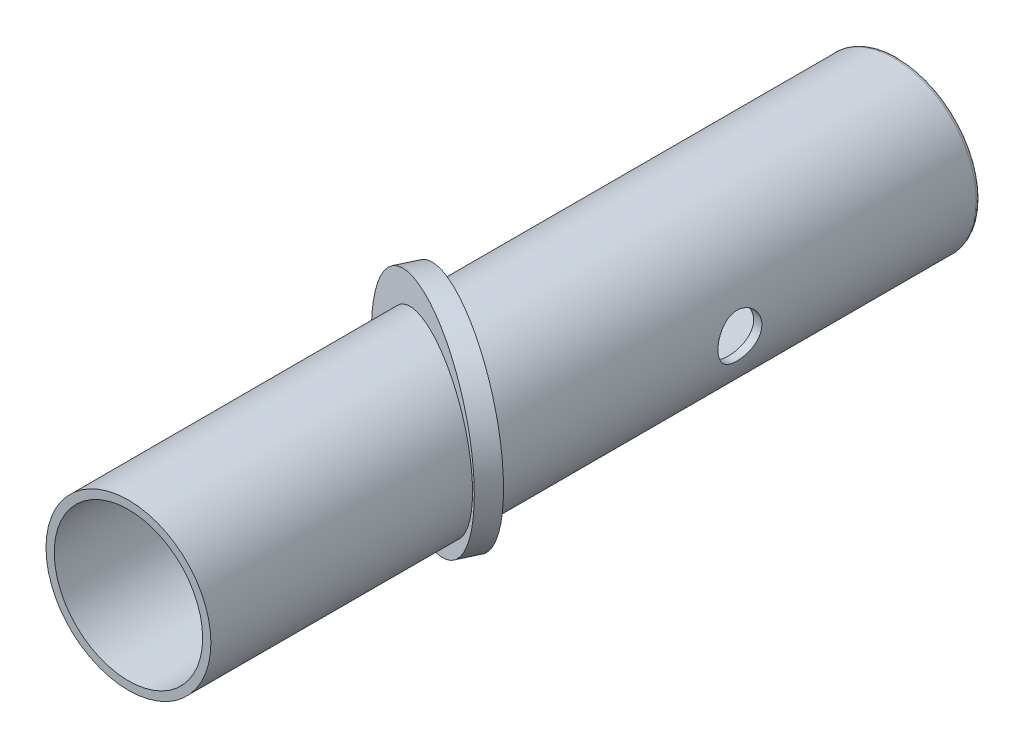
ISO-10303-21;
HEADER;
FILE_DESCRIPTION(('STEP AP214'),'2;1');
FILE_NAME('part.step','',(''),(''),'','','');
FILE_SCHEMA(('AUTOMOTIVE_DESIGN { 1 0 10303 214 1 1 1 1 }'));
ENDSEC;
DATA;
#1=APPLICATION_CONTEXT('core data for automotive mechanical design processes');
#2=APPLICATION_PROTOCOL_DEFINITION('international standard','automotive_design',2000,#1);
#3=PRODUCT_CONTEXT('',#1,'mechanical');
#4=PRODUCT('Part','Part','',(#3));
#5=PRODUCT_RELATED_PRODUCT_CATEGORY('part','',(#4));
#6=PRODUCT_DEFINITION_FORMATION('','',#4);
#7=PRODUCT_DEFINITION_CONTEXT('part definition',#1,'design');
#8=PRODUCT_DEFINITION('design','',#6,#7);
#9=PRODUCT_DEFINITION_SHAPE('','',#8);
#10=(LENGTH_UNIT() NAMED_UNIT(*) SI_UNIT(.MILLI.,.METRE.));
#11=(NAMED_UNIT(*) PLANE_ANGLE_UNIT() SI_UNIT($,.RADIAN.));
#12=(NAMED_UNIT(*) SI_UNIT($,.STERADIAN.) SOLID_ANGLE_UNIT());
#13=UNCERTAINTY_MEASURE_WITH_UNIT(LENGTH_MEASURE(1.E-05),#10,'distance_accuracy_value','');
#14=(GEOMETRIC_REPRESENTATION_CONTEXT(3) GLOBAL_UNCERTAINTY_ASSIGNED_CONTEXT((#13)) GLOBAL_UNIT_ASSIGNED_CONTEXT((#10,
#11,#12)) REPRESENTATION_CONTEXT('',''));
#15=CARTESIAN_POINT('',(0.,0.,0.));
#16=DIRECTION('',(0.,0.,1.));
#17=DIRECTION('',(1.,0.,0.));
#18=AXIS2_PLACEMENT_3D('',#15,#16,#17);
#19=CARTESIAN_POINT('',(0.,0.,70.));
#20=DIRECTION('',(0.,0.,-1.));
#21=DIRECTION('',(-1.,0.,0.));
#22=AXIS2_PLACEMENT_3D('',#19,#20,#21);
#23=CYLINDRICAL_SURFACE('',#22,7.5);
#24=CARTESIAN_POINT('',(0.,0.,0.369999999999995));
#25=DIRECTION('',(0.,0.,1.));
#26=DIRECTION('',(1.,0.,0.));
#27=AXIS2_PLACEMENT_3D('',#24,#25,#26);
#28=CIRCLE('',#27,7.5);
#29=CARTESIAN_POINT('',(7.5,0.,0.369999999999995));
#30=VERTEX_POINT('',#29);
#31=EDGE_CURVE('E50',#30,#30,#28,.T.);
#32=ORIENTED_EDGE('',*,*,#31,.T.);
#33=EDGE_LOOP('',(#32));
#34=FACE_BOUND('',#33,.T.);
#35=CARTESIAN_POINT('',(0.,0.,40.4973074361625));
#36=DIRECTION('',(-0.4226182617407,0.,0.90630778703665));
#37=DIRECTION('',(-0.90630778703665,0.,-0.4226182617407));
#38=AXIS2_PLACEMENT_3D('',#35,#36,#37);
#39=ELLIPSE('',#38,8.27533439221869,7.5);
#40=CARTESIAN_POINT('',(-7.5,0.,37.));
#41=VERTEX_POINT('',#40);
#42=EDGE_CURVE('E10',#41,#41,#39,.T.);
#43=ORIENTED_EDGE('',*,*,#42,.F.);
#44=EDGE_LOOP('',(#43));
#45=FACE_BOUND('',#44,.T.);
#46=CARTESIAN_POINT('',(7.5,0.,23.8752094524381));
#47=CARTESIAN_POINT('',(7.49999833810161,-0.110254555832854,23.8752068355033));
#48=CARTESIAN_POINT('',(7.49754486162151,-0.220537160221841,23.8660618382485));
#49=CARTESIAN_POINT('',(7.48799573621659,-0.437925451354464,23.8297882216995));
#50=CARTESIAN_POINT('',(7.48089785332586,-0.545029583319087,23.802650948012));
#51=CARTESIAN_POINT('',(7.4628433325279,-0.752891589045313,23.7313377855741));
#52=CARTESIAN_POINT('',(7.45189167130375,-0.853657451015286,23.6871838647721));
#53=CARTESIAN_POINT('',(7.42728699151678,-1.04635368639266,23.5831722097715));
#54=CARTESIAN_POINT('',(7.4136337929518,-1.13828347044963,23.5233134290789));
#55=CARTESIAN_POINT('',(7.38474614901995,-1.31282950374002,23.3881259360248));
#56=CARTESIAN_POINT('',(7.36948467678681,-1.39521168986279,23.3125007844299));
#57=CARTESIAN_POINT('',(7.33927409679591,-1.54628713660638,23.1485609693748));
#58=CARTESIAN_POINT('',(7.32432502947243,-1.61497863495665,23.0602446748206));
#59=CARTESIAN_POINT('',(7.29615537464372,-1.73786409243415,22.8715612176127));
#60=CARTESIAN_POINT('',(7.28296888563238,-1.79178877736488,22.7710131241764));
#61=CARTESIAN_POINT('',(7.26021477318187,-1.88187548076994,22.5618693413457));
#62=CARTESIAN_POINT('',(7.25064648253265,-1.91804077451369,22.4532751401067));
#63=CARTESIAN_POINT('',(7.23649115802399,-1.97076920226504,22.2337139146131));
#64=CARTESIAN_POINT('',(7.2317964781149,-1.98775670244692,22.1228559125074));
#65=CARTESIAN_POINT('',(7.2275983091637,-2.0029703470582,21.8997717691316));
#66=CARTESIAN_POINT('',(7.22809385014446,-2.00119999705754,21.7875458874141));
#67=CARTESIAN_POINT('',(7.2341237880203,-1.97928510002699,21.5682240370641));
#68=CARTESIAN_POINT('',(7.23951735511531,-1.95965406064765,21.4610722703997));
#69=CARTESIAN_POINT('',(7.25451013080688,-1.90339748722183,21.2516411179819));
#70=CARTESIAN_POINT('',(7.26410967552612,-1.86677059492995,21.1493621223628));
#71=CARTESIAN_POINT('',(7.28655661748386,-1.77714356965256,20.9512413086296));
#72=CARTESIAN_POINT('',(7.29943942818703,-1.72396341137785,20.8554851131519));
#73=CARTESIAN_POINT('',(7.32698229642445,-1.60286503823778,20.6740752935866));
#74=CARTESIAN_POINT('',(7.34164270355186,-1.53494392224252,20.5884236632817));
#75=CARTESIAN_POINT('',(7.37167510629864,-1.38366607263419,20.4267204549834));
#76=CARTESIAN_POINT('',(7.38705471488831,-1.29987812728299,20.3510731341232));
#77=CARTESIAN_POINT('',(7.41636381276316,-1.12061766820637,20.2148206720879));
#78=CARTESIAN_POINT('',(7.43029324488555,-1.02514469420509,20.1542161237357));
#79=CARTESIAN_POINT('',(7.45521820398293,-0.824598255497453,20.0495915496135));
#80=CARTESIAN_POINT('',(7.4662007283356,-0.719484902551791,20.0056446819896));
#81=CARTESIAN_POINT('',(7.48390044400999,-0.503002294390397,19.9361622636248));
#82=CARTESIAN_POINT('',(7.49061856733749,-0.391634411928325,19.9106226897142));
#83=CARTESIAN_POINT('',(7.49889158558384,-0.169254083145517,19.8793145755203));
#84=CARTESIAN_POINT('',(7.50058997470959,-0.0583242376413814,19.8729964125873));
#85=CARTESIAN_POINT('',(7.49904471691695,0.163010045901198,19.8787926166851));
#86=CARTESIAN_POINT('',(7.49580158080353,0.273414537062114,19.8909050785439));
#87=CARTESIAN_POINT('',(7.48483035496021,0.488602449901781,19.9327678998981));
#88=CARTESIAN_POINT('',(7.47718026546329,0.593449852027783,19.9622116986359));
#89=CARTESIAN_POINT('',(7.45826294894139,0.796706971176066,20.0375453969461));
#90=CARTESIAN_POINT('',(7.44699532996161,0.895115989216028,20.0834370786887));
#91=CARTESIAN_POINT('',(7.42175660559528,1.08483847466795,20.1913833396187));
#92=CARTESIAN_POINT('',(7.40773686604957,1.17597518846119,20.2537369192359));
#93=CARTESIAN_POINT('',(7.37861452365563,1.34668463539715,20.3924610825961));
#94=CARTESIAN_POINT('',(7.3635117072752,1.42625507879918,20.4688344350392));
#95=CARTESIAN_POINT('',(7.33339745866704,1.57388924478774,20.6359950299327));
#96=CARTESIAN_POINT('',(7.31840061429312,1.64156519249816,20.7271280138333));
#97=CARTESIAN_POINT('',(7.29066447182727,1.76067191185119,20.9197741485378));
#98=CARTESIAN_POINT('',(7.27792507956316,1.81210336122161,21.0212868660605));
#99=CARTESIAN_POINT('',(7.2562926837321,1.89687411586113,21.2313047595143));
#100=CARTESIAN_POINT('',(7.24737748318009,1.93031812253958,21.3397652642557));
#101=CARTESIAN_POINT('',(7.234398251268,1.97841205118791,21.5610487721129));
#102=CARTESIAN_POINT('',(7.23033298020014,1.99306677602478,21.6738706527861));
#103=CARTESIAN_POINT('',(7.22761744573588,2.00288989653714,21.8967042403219));
#104=CARTESIAN_POINT('',(7.22879397743239,1.99868155618109,22.0066867726964));
#105=CARTESIAN_POINT('',(7.23602396081087,1.97234376000439,22.2243129664482));
#106=CARTESIAN_POINT('',(7.24207728699439,1.95021476535026,22.3319566879387));
#107=CARTESIAN_POINT('',(7.25827571073158,1.88902515699699,22.541065204568));
#108=CARTESIAN_POINT('',(7.26838885019644,1.8500966107558,22.6425712951703));
#109=CARTESIAN_POINT('',(7.29156818136177,1.75651554562386,22.8376882829723));
#110=CARTESIAN_POINT('',(7.30463483621364,1.70186056024617,22.9312979387386));
#111=CARTESIAN_POINT('',(7.3327292144046,1.57648909268817,23.1109398119348));
#112=CARTESIAN_POINT('',(7.3478033310169,1.5053472976791,23.1966679874144));
#113=CARTESIAN_POINT('',(7.37795503783007,1.349830535111,23.3551719041055));
#114=CARTESIAN_POINT('',(7.39303262798441,1.26545235435875,23.427944491107));
#115=CARTESIAN_POINT('',(7.42187812403968,1.08367998108869,23.560001690085));
#116=CARTESIAN_POINT('',(7.43561111314551,0.986045961751781,23.6189644630875));
#117=CARTESIAN_POINT('',(7.45983810102897,0.78188864041689,23.7195468683675));
#118=CARTESIAN_POINT('',(7.47033417683594,0.675371094696297,23.7611776281018));
#119=CARTESIAN_POINT('',(7.48554752513468,0.474374704880991,23.8204847378537));
#120=CARTESIAN_POINT('',(7.49092770592602,0.380762016565036,23.8409588360307));
#121=CARTESIAN_POINT('',(7.49815449036456,0.191439795317076,23.8683216586052));
#122=CARTESIAN_POINT('',(7.5000014429727,0.0957304704048601,23.8752117246382));
#123=CARTESIAN_POINT('',(7.5,0.,23.8752094524381));
#124=B_SPLINE_CURVE_WITH_KNOTS('',3,(#46,#47,#48,#49,#50,#51,#52,#53,#54,#55,#56,#57,#58,#59,
#60,#61,#62,#63,#64,#65,#66,#67,#68,#69,#70,#71,#72,#73,#74,#75,#76,#77,#78,#79,#80,#81,#82,#83,
#84,#85,#86,#87,#88,#89,#90,#91,#92,#93,#94,#95,#96,#97,#98,#99,#100,#101,#102,#103,#104,#105,
#106,#107,#108,#109,#110,#111,#112,#113,#114,#115,#116,#117,#118,#119,#120,#121,#122,#123),
.UNSPECIFIED.,.T.,.F.,(4,2,2,2,2,2,2,2,2,2,2,2,2,2,2,2,2,2,2,2,2,2,2,2,2,2,2,2,2,2,2,2,2,2,2,2,
2,2,4),(0.,0.330412598949569,0.66098424376145,0.991130552971933,1.32129886708675,
1.65834897954967,1.99544244925149,2.33832582523229,2.681145941297,3.01622158250468,
3.3512346040432,3.67691002045997,4.0026114681294,4.33198673346499,4.6614268811763,
5.00161259812323,5.34181171937598,5.68348809603042,6.02508977190139,6.35682717524548,
6.68853028925352,7.01453535642117,7.34057575775616,7.67300286004551,8.00549568258888,
8.34736496382789,8.68921998024109,9.02906297699388,9.36881908663984,9.69743342403613,
10.026039305206,10.352107654483,10.67822717123,11.0139433957139,11.3497412433245,
11.692722522809,12.0354832614518,12.3223981899334,12.6092847796638),.UNSPECIFIED.);
#125=CARTESIAN_POINT('',(7.5,0.,23.8752094524381));
#126=VERTEX_POINT('',#125);
#127=EDGE_CURVE('E105',#126,#126,#124,.T.);
#128=ORIENTED_EDGE('',*,*,#127,.F.);
#129=EDGE_LOOP('',(#128));
#130=FACE_BOUND('',#129,.T.);
#131=ADVANCED_FACE('F37',(#34,#45,#130),#23,.T.);
#132=CARTESIAN_POINT('',(0.,0.,70.));
#133=DIRECTION('',(0.,0.,-1.));
#134=DIRECTION('',(-1.,0.,0.));
#135=AXIS2_PLACEMENT_3D('',#132,#133,#134);
#136=CYLINDRICAL_SURFACE('',#135,6.75);
#137=CARTESIAN_POINT('',(0.,0.,0.369999999999995));
#138=DIRECTION('',(0.,0.,1.));
#139=DIRECTION('',(1.,0.,0.));
#140=AXIS2_PLACEMENT_3D('',#137,#138,#139);
#141=CIRCLE('',#140,6.75);
#142=CARTESIAN_POINT('',(6.75,0.,0.369999999999995));
#143=VERTEX_POINT('',#142);
#144=EDGE_CURVE('E55',#143,#143,#141,.F.);
#145=ORIENTED_EDGE('',*,*,#144,.T.);
#146=EDGE_LOOP('',(#145));
#147=FACE_BOUND('',#146,.T.);
#148=CARTESIAN_POINT('',(0.,0.,70.));
#149=DIRECTION('',(0.,0.,1.));
#150=DIRECTION('',(1.,0.,0.));
#151=AXIS2_PLACEMENT_3D('',#148,#149,#150);
#152=CIRCLE('',#151,6.75);
#153=CARTESIAN_POINT('',(6.75,0.,70.));
#154=VERTEX_POINT('',#153);
#155=EDGE_CURVE('E63',#154,#154,#152,.T.);
#156=ORIENTED_EDGE('',*,*,#155,.T.);
#157=EDGE_LOOP('',(#156));
#158=FACE_BOUND('',#157,.T.);
#159=CARTESIAN_POINT('',(6.75,0.,23.8752094524381));
#160=CARTESIAN_POINT('',(6.74999895357174,-0.109780507827997,23.8752079552797));
#161=CARTESIAN_POINT('',(6.74729613961413,-0.219576188157136,23.8661406206399));
#162=CARTESIAN_POINT('',(6.7367779386325,-0.435974163095877,23.8301943682222));
#163=CARTESIAN_POINT('',(6.72896091933207,-0.542575426794903,23.803309763756));
#164=CARTESIAN_POINT('',(6.70907157188689,-0.749431834060115,23.7327025235036));
#165=CARTESIAN_POINT('',(6.69700543365303,-0.849695959996787,23.6890043723485));
#166=CARTESIAN_POINT('',(6.66987440163433,-1.04147390890969,23.5861097716068));
#167=CARTESIAN_POINT('',(6.65480913098969,-1.13298663007551,23.5269113740218));
#168=CARTESIAN_POINT('',(6.62281609852056,-1.30723335618362,23.3929450091111));
#169=CARTESIAN_POINT('',(6.60585087876647,-1.38968692651201,23.3178212521535));
#170=CARTESIAN_POINT('',(6.57219540945145,-1.54102903218837,23.1548952063222));
#171=CARTESIAN_POINT('',(6.55550520520277,-1.60991535224076,23.067090850978));
#172=CARTESIAN_POINT('',(6.52389477512094,-1.73363046162768,22.8789389284841));
#173=CARTESIAN_POINT('',(6.50902118305508,-1.78811926435753,22.7783592416816));
#174=CARTESIAN_POINT('',(6.48328681863478,-1.8792957384254,22.5689526467707));
#175=CARTESIAN_POINT('',(6.47242510947398,-1.91598756612525,22.4601276711642));
#176=CARTESIAN_POINT('',(6.45633424438028,-1.969521633465,22.2404639335786));
#177=CARTESIAN_POINT('',(6.45095899226571,-1.98687991736363,22.1297619221615));
#178=CARTESIAN_POINT('',(6.44601480296172,-2.00286530285513,21.9068965338744));
#179=CARTESIAN_POINT('',(6.4464444977017,-2.00149681784523,21.7947335075514));
#180=CARTESIAN_POINT('',(6.45293201970745,-1.9804733446018,21.5763062217923));
#181=CARTESIAN_POINT('',(6.45879167330767,-1.96146221318409,21.4699731354392));
#182=CARTESIAN_POINT('',(6.47515865740568,-1.90673230983323,21.2620788744826));
#183=CARTESIAN_POINT('',(6.48566643641889,-1.87101192554119,21.1605181614302));
#184=CARTESIAN_POINT('',(6.51030570383787,-1.78339749199777,20.9634647774697));
#185=CARTESIAN_POINT('',(6.52448396112885,-1.73129268359001,20.8680719123078));
#186=CARTESIAN_POINT('',(6.55484386592104,-1.61253500191673,20.6871667238014));
#187=CARTESIAN_POINT('',(6.57102598825196,-1.54587867770291,20.6016567515928));
#188=CARTESIAN_POINT('',(6.60437650489371,-1.39670138313682,20.4392895715196));
#189=CARTESIAN_POINT('',(6.62155824094315,-1.31364532643575,20.3629258946316));
#190=CARTESIAN_POINT('',(6.65438787229502,-1.1356922979027,20.225097525485));
#191=CARTESIAN_POINT('',(6.67003567568601,-1.04079461730789,20.1636337256849));
#192=CARTESIAN_POINT('',(6.69817136452503,-0.840970715212555,20.0570600205953));
#193=CARTESIAN_POINT('',(6.71063839704817,-0.735984228183308,20.0120572392073));
#194=CARTESIAN_POINT('',(6.73085759101367,-0.519478083537604,19.9404919485223));
#195=CARTESIAN_POINT('',(6.73861103395821,-0.407960210682308,19.9139244268805));
#196=CARTESIAN_POINT('',(6.74832777999005,-0.185754367320838,19.8807999840593));
#197=CARTESIAN_POINT('',(6.75048461171956,-0.0751744544281668,19.8735739513063));
#198=CARTESIAN_POINT('',(6.74933156704897,0.145624015554762,19.8774653941636));
#199=CARTESIAN_POINT('',(6.74602240079799,0.25584261772287,19.8885804868724));
#200=CARTESIAN_POINT('',(6.7344357004489,0.470280296286971,19.9282966132336));
#201=CARTESIAN_POINT('',(6.7262687424719,0.574577941871163,19.9565087350157));
#202=CARTESIAN_POINT('',(6.70590917298922,0.776938410671506,20.0291520700894));
#203=CARTESIAN_POINT('',(6.69371608204546,0.875000489687504,20.0735852150718));
#204=CARTESIAN_POINT('',(6.66622462760101,1.06458432647057,20.1785460025249));
#205=CARTESIAN_POINT('',(6.65086191667895,1.15590648191309,20.2394168704825));
#206=CARTESIAN_POINT('',(6.61879673108033,1.32726877958423,20.3751065285707));
#207=CARTESIAN_POINT('',(6.60209392925366,1.40730615368216,20.4499287305139));
#208=CARTESIAN_POINT('',(6.56849170341841,1.55675893312647,20.6145391598418));
#209=CARTESIAN_POINT('',(6.55160621339354,1.62569863061477,20.7047630583946));
#210=CARTESIAN_POINT('',(6.52018017865221,1.74748984960258,20.8958652806182));
#211=CARTESIAN_POINT('',(6.50563956650847,1.80034183374538,20.9967432977902));
#212=CARTESIAN_POINT('',(6.48071797240951,1.88808842707279,21.2059409511222));
#213=CARTESIAN_POINT('',(6.47031687516707,1.92307011535889,21.3142215286699));
#214=CARTESIAN_POINT('',(6.45490091242077,1.97420394917347,21.5355004948714));
#215=CARTESIAN_POINT('',(6.44988425845241,1.99036234708587,21.6484973040462));
#216=CARTESIAN_POINT('',(6.44597836214003,2.0029730578667,21.87106801564));
#217=CARTESIAN_POINT('',(6.44684840439166,2.00019948383777,21.9805944155486));
#218=CARTESIAN_POINT('',(6.45404087889643,1.97686673394052,22.1975443736782));
#219=CARTESIAN_POINT('',(6.46036310271065,1.95630823799625,22.3049680121279));
#220=CARTESIAN_POINT('',(6.47758812520025,1.89848338352936,22.5134317358436));
#221=CARTESIAN_POINT('',(6.48843594234712,1.8614172236977,22.6145322303961));
#222=CARTESIAN_POINT('',(6.51348097902859,1.77178472154567,22.8091600015472));
#223=CARTESIAN_POINT('',(6.52767882723387,1.71921546943394,22.902685852249));
#224=CARTESIAN_POINT('',(6.55845570703591,1.59787466680533,23.0831138913838));
#225=CARTESIAN_POINT('',(6.5751015613966,1.52859251647181,23.1696612962883));
#226=CARTESIAN_POINT('',(6.60856912953431,1.37671764046891,23.330152613648));
#227=CARTESIAN_POINT('',(6.6253908875096,1.29412149047669,23.4040932735898));
#228=CARTESIAN_POINT('',(6.65788498158106,1.11514975355066,23.5393526719684));
#229=CARTESIAN_POINT('',(6.67351137161211,1.01845059715654,23.6002554312085));
#230=CARTESIAN_POINT('',(6.70130862680841,0.815722252703583,23.7048519226204));
#231=CARTESIAN_POINT('',(6.71348118010808,0.709697655959116,23.7485540660082));
#232=CARTESIAN_POINT('',(6.73187584792081,0.503779578000332,23.8133790632891));
#233=CARTESIAN_POINT('',(6.73861704128744,0.404558947214438,23.8365037258882));
#234=CARTESIAN_POINT('',(6.74767925362443,0.203562954982656,23.8674184043831));
#235=CARTESIAN_POINT('',(6.75000097024364,0.101787999327255,23.8752108405968));
#236=CARTESIAN_POINT('',(6.75,0.,23.8752094524381));
#237=B_SPLINE_CURVE_WITH_KNOTS('',3,(#159,#160,#161,#162,#163,#164,#165,#166,#167,#168,#169,
#170,#171,#172,#173,#174,#175,#176,#177,#178,#179,#180,#181,#182,#183,#184,#185,#186,#187,#188,
#189,#190,#191,#192,#193,#194,#195,#196,#197,#198,#199,#200,#201,#202,#203,#204,#205,#206,#207,
#208,#209,#210,#211,#212,#213,#214,#215,#216,#217,#218,#219,#220,#221,#222,#223,#224,#225,#226,
#227,#228,#229,#230,#231,#232,#233,#234,#235,#236),.UNSPECIFIED.,.T.,.F.,(4,2,2,2,2,2,2,2,2,2,2,
2,2,2,2,2,2,2,2,2,2,2,2,2,2,2,2,2,2,2,2,2,2,2,2,2,2,2,4),(0.,0.328967704896551,0.65804045609361,
0.986635799666843,1.31527245939874,1.65221766342732,1.98921783920761,2.33358031728811,
2.67786233309664,3.01271657391682,3.34749189993189,3.67051088328316,3.99356104277411,
4.320949543795,4.64841577077394,4.98920393821033,5.33001251280931,5.6730010975093,
6.01589639080056,6.34676605629498,6.67759273818107,7.00116255654673,7.32477092000541,
7.6557430431897,7.98679621234535,8.32955627438707,8.67230647855638,9.0133701910724,
9.35432058281285,9.68141576699805,10.0084984467677,10.3317180629328,10.6549983831726,
10.9897984380869,11.324684740422,11.6690395665297,12.0132257909865,12.3182913470032,
12.6233087420508),.UNSPECIFIED.);
#238=CARTESIAN_POINT('',(6.75,0.,23.8752094524381));
#239=VERTEX_POINT('',#238);
#240=EDGE_CURVE('E41',#239,#239,#237,.T.);
#241=ORIENTED_EDGE('',*,*,#240,.T.);
#242=EDGE_LOOP('',(#241));
#243=FACE_BOUND('',#242,.T.);
#244=ADVANCED_FACE('F79',(#147,#158,#243),#136,.F.);
#245=CARTESIAN_POINT('',(0.,0.,0.));
#246=DIRECTION('',(0.,0.,1.));
#247=DIRECTION('',(1.,0.,0.));
#248=AXIS2_PLACEMENT_3D('',#245,#246,#247);
#249=PLANE('',#248);
#250=CARTESIAN_POINT('',(0.,0.,0.));
#251=DIRECTION('',(0.,0.,1.));
#252=DIRECTION('',(1.,0.,0.));
#253=AXIS2_PLACEMENT_3D('',#250,#251,#252);
#254=CIRCLE('',#253,7.12);
#255=CARTESIAN_POINT('',(7.12,0.,0.));
#256=VERTEX_POINT('',#255);
#257=EDGE_CURVE('E73',#256,#256,#254,.T.);
#258=ORIENTED_EDGE('',*,*,#257,.T.);
#259=EDGE_LOOP('',(#258));
#260=FACE_BOUND('',#259,.T.);
#261=CARTESIAN_POINT('',(0.,0.,0.));
#262=DIRECTION('',(0.,0.,1.));
#263=DIRECTION('',(1.,0.,0.));
#264=AXIS2_PLACEMENT_3D('',#261,#262,#263);
#265=CIRCLE('',#264,7.13);
#266=CARTESIAN_POINT('',(7.13,0.,0.));
#267=VERTEX_POINT('',#266);
#268=EDGE_CURVE('E70',#267,#267,#265,.F.);
#269=ORIENTED_EDGE('',*,*,#268,.T.);
#270=EDGE_LOOP('',(#269));
#271=FACE_BOUND('',#270,.T.);
#272=ADVANCED_FACE('F85',(#260,#271),#249,.F.);
#273=CARTESIAN_POINT('',(0.,0.,0.369999999999995));
#274=DIRECTION('',(0.,0.,1.));
#275=DIRECTION('',(1.,0.,0.));
#276=AXIS2_PLACEMENT_3D('',#273,#274,#275);
#277=TOROIDAL_SURFACE('',#276,7.12,0.37);
#278=ORIENTED_EDGE('',*,*,#144,.F.);
#279=EDGE_LOOP('',(#278));
#280=FACE_BOUND('',#279,.T.);
#281=ORIENTED_EDGE('',*,*,#257,.F.);
#282=EDGE_LOOP('',(#281));
#283=FACE_BOUND('',#282,.T.);
#284=ADVANCED_FACE('F82',(#280,#283),#277,.T.);
#285=CARTESIAN_POINT('',(0.,0.,0.369999999999995));
#286=DIRECTION('',(0.,0.,1.));
#287=DIRECTION('',(1.,0.,0.));
#288=AXIS2_PLACEMENT_3D('',#285,#286,#287);
#289=TOROIDAL_SURFACE('',#288,7.13,0.37);
#290=ORIENTED_EDGE('',*,*,#268,.F.);
#291=EDGE_LOOP('',(#290));
#292=FACE_BOUND('',#291,.T.);
#293=ORIENTED_EDGE('',*,*,#31,.F.);
#294=EDGE_LOOP('',(#293));
#295=FACE_BOUND('',#294,.T.);
#296=ADVANCED_FACE('F39',(#292,#295),#289,.T.);
#297=CARTESIAN_POINT('',(-0.966415432027172,0.,42.253416357174));
#298=DIRECTION('',(0.4226182617407,0.,-0.90630778703665));
#299=DIRECTION('',(-0.90630778703665,0.,-0.4226182617407));
#300=AXIS2_PLACEMENT_3D('',#297,#298,#299);
#301=CYLINDRICAL_SURFACE('',#300,9.67851705156033);
#302=CARTESIAN_POINT('',(-0.966415432027172,0.,42.253416357174));
#303=DIRECTION('',(-0.4226182617407,0.,0.90630778703665));
#304=DIRECTION('',(0.90630778703665,0.,0.4226182617407));
#305=AXIS2_PLACEMENT_3D('',#302,#303,#304);
#306=CIRCLE('',#305,9.67851705156033);
#307=CARTESIAN_POINT('',(7.80529993876895,0.,46.3437344097322));
#308=VERTEX_POINT('',#307);
#309=EDGE_CURVE('E64',#308,#308,#306,.T.);
#310=ORIENTED_EDGE('',*,*,#309,.F.);
#311=EDGE_LOOP('',(#310));
#312=FACE_BOUND('',#311,.T.);
#313=CARTESIAN_POINT('',(-0.121178908545771,0.,40.4408007831007));
#314=DIRECTION('',(-0.4226182617407,0.,0.90630778703665));
#315=DIRECTION('',(0.90630778703665,0.,0.4226182617407));
#316=AXIS2_PLACEMENT_3D('',#313,#314,#315);
#317=CIRCLE('',#316,9.67851705156033);
#318=CARTESIAN_POINT('',(8.65053646225035,0.,44.5311188356589));
#319=VERTEX_POINT('',#318);
#320=EDGE_CURVE('E58',#319,#319,#317,.T.);
#321=ORIENTED_EDGE('',*,*,#320,.T.);
#322=EDGE_LOOP('',(#321));
#323=FACE_BOUND('',#322,.T.);
#324=ADVANCED_FACE('F95',(#312,#323),#301,.T.);
#325=CARTESIAN_POINT('',(-0.966415432027172,0.,42.253416357174));
#326=DIRECTION('',(-0.4226182617407,0.,0.90630778703665));
#327=DIRECTION('',(0.90630778703665,0.,0.4226182617407));
#328=AXIS2_PLACEMENT_3D('',#325,#326,#327);
#329=PLANE('',#328);
#330=CARTESIAN_POINT('',(0.,0.,42.7040632740875));
#331=DIRECTION('',(-0.4226182617407,0.,0.90630778703665));
#332=DIRECTION('',(-0.90630778703665,0.,-0.4226182617407));
#333=AXIS2_PLACEMENT_3D('',#330,#331,#332);
#334=ELLIPSE('',#333,8.27533439221869,7.5);
#335=CARTESIAN_POINT('',(-7.5,0.,39.206755837925));
#336=VERTEX_POINT('',#335);
#337=EDGE_CURVE('E60',#336,#336,#334,.T.);
#338=ORIENTED_EDGE('',*,*,#337,.F.);
#339=EDGE_LOOP('',(#338));
#340=FACE_BOUND('',#339,.T.);
#341=ORIENTED_EDGE('',*,*,#309,.T.);
#342=EDGE_LOOP('',(#341));
#343=FACE_BOUND('',#342,.T.);
#344=ADVANCED_FACE('F120',(#340,#343),#329,.T.);
#345=CARTESIAN_POINT('',(-0.121178908545771,0.,40.4408007831007));
#346=DIRECTION('',(-0.4226182617407,0.,0.90630778703665));
#347=DIRECTION('',(0.90630778703665,0.,0.4226182617407));
#348=AXIS2_PLACEMENT_3D('',#345,#346,#347);
#349=PLANE('',#348);
#350=ORIENTED_EDGE('',*,*,#42,.T.);
#351=EDGE_LOOP('',(#350));
#352=FACE_BOUND('',#351,.T.);
#353=ORIENTED_EDGE('',*,*,#320,.F.);
#354=EDGE_LOOP('',(#353));
#355=FACE_BOUND('',#354,.T.);
#356=ADVANCED_FACE('F124',(#352,#355),#349,.F.);
#357=ORIENTED_EDGE('',*,*,#337,.T.);
#358=EDGE_LOOP('',(#357));
#359=FACE_BOUND('',#358,.T.);
#360=CARTESIAN_POINT('',(0.,0.,70.));
#361=DIRECTION('',(0.,0.,1.));
#362=DIRECTION('',(1.,0.,0.));
#363=AXIS2_PLACEMENT_3D('',#360,#361,#362);
#364=CIRCLE('',#363,7.5);
#365=CARTESIAN_POINT('',(7.5,0.,70.));
#366=VERTEX_POINT('',#365);
#367=EDGE_CURVE('E67',#366,#366,#364,.T.);
#368=ORIENTED_EDGE('',*,*,#367,.F.);
#369=EDGE_LOOP('',(#368));
#370=FACE_BOUND('',#369,.T.);
#371=ADVANCED_FACE('F101',(#359,#370),#23,.T.);
#372=CARTESIAN_POINT('',(0.,0.,70.));
#373=DIRECTION('',(0.,0.,1.));
#374=DIRECTION('',(1.,0.,0.));
#375=AXIS2_PLACEMENT_3D('',#372,#373,#374);
#376=PLANE('',#375);
#377=ORIENTED_EDGE('',*,*,#367,.T.);
#378=EDGE_LOOP('',(#377));
#379=FACE_BOUND('',#378,.T.);
#380=ORIENTED_EDGE('',*,*,#155,.F.);
#381=EDGE_LOOP('',(#380));
#382=FACE_BOUND('',#381,.T.);
#383=ADVANCED_FACE('F118',(#379,#382),#376,.T.);
#384=CARTESIAN_POINT('',(10.,0.,21.8752094524381));
#385=DIRECTION('',(-1.,0.,0.));
#386=DIRECTION('',(0.,0.,1.));
#387=AXIS2_PLACEMENT_3D('',#384,#385,#386);
#388=CYLINDRICAL_SURFACE('',#387,2.);
#389=ORIENTED_EDGE('',*,*,#240,.F.);
#390=EDGE_LOOP('',(#389));
#391=FACE_BOUND('',#390,.T.);
#392=ORIENTED_EDGE('',*,*,#127,.T.);
#393=EDGE_LOOP('',(#392));
#394=FACE_BOUND('',#393,.T.);
#395=ADVANCED_FACE('F114',(#391,#394),#388,.F.);
#396=CLOSED_SHELL('',(#131,#244,#272,#284,#296,#324,#344,#356,#371,#383,#395));
#397=MANIFOLD_SOLID_BREP('B2',#396);
#398=ADVANCED_BREP_SHAPE_REPRESENTATION('',(#18,#397),#14);
#399=SHAPE_DEFINITION_REPRESENTATION(#9,#398);
ENDSEC;
END-ISO-10303-21;
